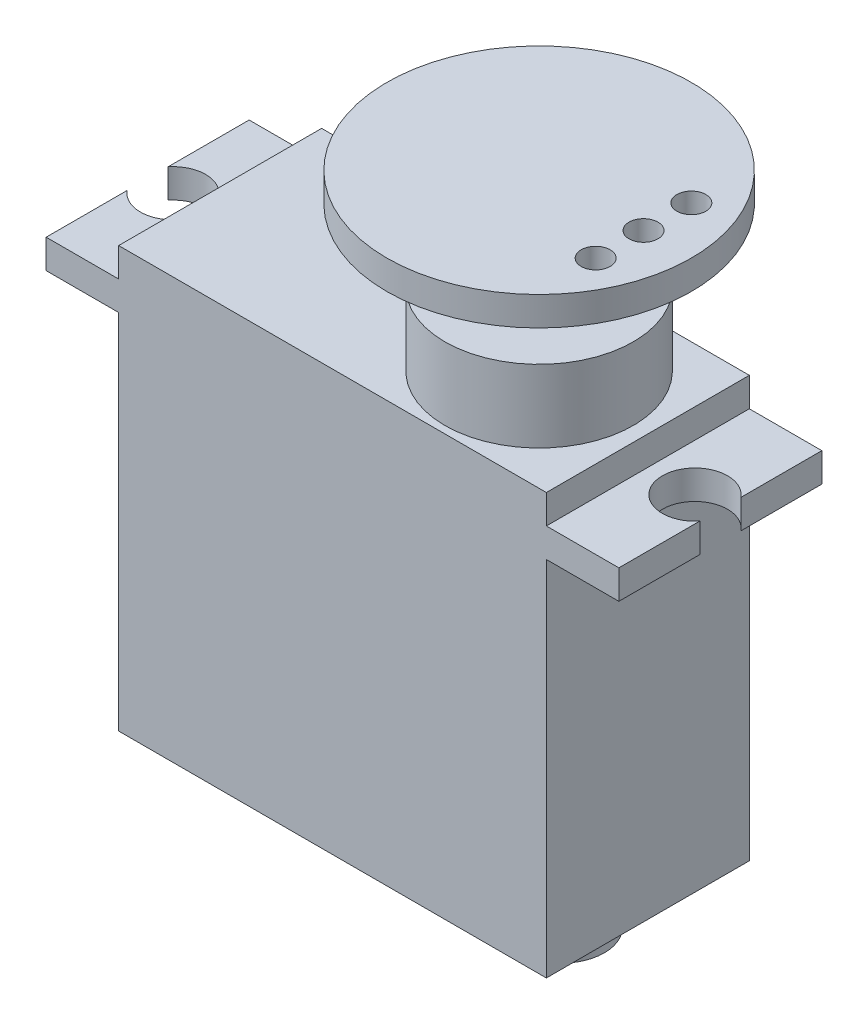
ISO-10303-21;
HEADER;
FILE_DESCRIPTION(('STEP AP214'),'2;1');
FILE_NAME('part.step','',(''),(''),'','','');
FILE_SCHEMA(('AUTOMOTIVE_DESIGN { 1 0 10303 214 1 1 1 1 }'));
ENDSEC;
DATA;
#1=APPLICATION_CONTEXT('core data for automotive mechanical design processes');
#2=APPLICATION_PROTOCOL_DEFINITION('international standard','automotive_design',2000,#1);
#3=PRODUCT_CONTEXT('',#1,'mechanical');
#4=PRODUCT('Part','Part','',(#3));
#5=PRODUCT_RELATED_PRODUCT_CATEGORY('part','',(#4));
#6=PRODUCT_DEFINITION_FORMATION('','',#4);
#7=PRODUCT_DEFINITION_CONTEXT('part definition',#1,'design');
#8=PRODUCT_DEFINITION('design','',#6,#7);
#9=PRODUCT_DEFINITION_SHAPE('','',#8);
#10=(LENGTH_UNIT() NAMED_UNIT(*) SI_UNIT(.MILLI.,.METRE.));
#11=(NAMED_UNIT(*) PLANE_ANGLE_UNIT() SI_UNIT($,.RADIAN.));
#12=(NAMED_UNIT(*) SI_UNIT($,.STERADIAN.) SOLID_ANGLE_UNIT());
#13=UNCERTAINTY_MEASURE_WITH_UNIT(LENGTH_MEASURE(1.E-05),#10,'distance_accuracy_value','');
#14=(GEOMETRIC_REPRESENTATION_CONTEXT(3) GLOBAL_UNCERTAINTY_ASSIGNED_CONTEXT((#13)) GLOBAL_UNIT_ASSIGNED_CONTEXT((#10,
#11,#12)) REPRESENTATION_CONTEXT('',''));
#15=CARTESIAN_POINT('',(0.,0.,0.));
#16=DIRECTION('',(0.,0.,1.));
#17=DIRECTION('',(1.,0.,0.));
#18=AXIS2_PLACEMENT_3D('',#15,#16,#17);
#19=CARTESIAN_POINT('',(7.25,12.,0.));
#20=DIRECTION('',(0.,1.,0.));
#21=DIRECTION('',(0.,0.,1.));
#22=AXIS2_PLACEMENT_3D('',#19,#20,#21);
#23=PLANE('',#22);
#24=CARTESIAN_POINT('',(14.45,12.,3.3));
#25=DIRECTION('',(0.,1.,0.));
#26=DIRECTION('',(0.,0.,1.));
#27=AXIS2_PLACEMENT_3D('',#24,#25,#26);
#28=CIRCLE('',#27,1.);
#29=CARTESIAN_POINT('',(14.45,12.,4.3));
#30=VERTEX_POINT('',#29);
#31=EDGE_CURVE('E616',#30,#30,#28,.F.);
#32=ORIENTED_EDGE('',*,*,#31,.T.);
#33=EDGE_LOOP('',(#32));
#34=FACE_BOUND('',#33,.T.);
#35=CARTESIAN_POINT('',(7.25,12.,0.));
#36=DIRECTION('',(0.,1.,0.));
#37=DIRECTION('',(0.,0.,1.));
#38=AXIS2_PLACEMENT_3D('',#35,#36,#37);
#39=CIRCLE('',#38,10.5);
#40=CARTESIAN_POINT('',(7.25,12.,10.5));
#41=VERTEX_POINT('',#40);
#42=EDGE_CURVE('E603',#41,#41,#39,.T.);
#43=ORIENTED_EDGE('',*,*,#42,.T.);
#44=EDGE_LOOP('',(#43));
#45=FACE_BOUND('',#44,.T.);
#46=CARTESIAN_POINT('',(14.45,12.,0.));
#47=DIRECTION('',(0.,1.,0.));
#48=DIRECTION('',(0.,0.,1.));
#49=AXIS2_PLACEMENT_3D('',#46,#47,#48);
#50=CIRCLE('',#49,1.);
#51=CARTESIAN_POINT('',(14.45,12.,1.));
#52=VERTEX_POINT('',#51);
#53=EDGE_CURVE('E608',#52,#52,#50,.T.);
#54=ORIENTED_EDGE('',*,*,#53,.F.);
#55=EDGE_LOOP('',(#54));
#56=FACE_BOUND('',#55,.T.);
#57=CARTESIAN_POINT('',(14.45,12.,-3.3));
#58=DIRECTION('',(0.,1.,0.));
#59=DIRECTION('',(0.,0.,1.));
#60=AXIS2_PLACEMENT_3D('',#57,#58,#59);
#61=CIRCLE('',#60,1.);
#62=CARTESIAN_POINT('',(14.45,12.,-2.3));
#63=VERTEX_POINT('',#62);
#64=EDGE_CURVE('E595',#63,#63,#61,.T.);
#65=ORIENTED_EDGE('',*,*,#64,.F.);
#66=EDGE_LOOP('',(#65));
#67=FACE_BOUND('',#66,.T.);
#68=ADVANCED_FACE('F34',(#34,#45,#56,#67),#23,.T.);
#69=CARTESIAN_POINT('',(7.25,10.,0.));
#70=DIRECTION('',(0.,1.,0.));
#71=DIRECTION('',(0.,0.,1.));
#72=AXIS2_PLACEMENT_3D('',#69,#70,#71);
#73=PLANE('',#72);
#74=CARTESIAN_POINT('',(14.45,10.,0.));
#75=DIRECTION('',(0.,1.,0.));
#76=DIRECTION('',(0.,0.,1.));
#77=AXIS2_PLACEMENT_3D('',#74,#75,#76);
#78=CIRCLE('',#77,1.);
#79=CARTESIAN_POINT('',(14.45,10.,1.));
#80=VERTEX_POINT('',#79);
#81=EDGE_CURVE('E605',#80,#80,#78,.F.);
#82=ORIENTED_EDGE('',*,*,#81,.F.);
#83=EDGE_LOOP('',(#82));
#84=FACE_BOUND('',#83,.T.);
#85=CARTESIAN_POINT('',(14.45,10.,3.3));
#86=DIRECTION('',(0.,1.,0.));
#87=DIRECTION('',(0.,0.,1.));
#88=AXIS2_PLACEMENT_3D('',#85,#86,#87);
#89=CIRCLE('',#88,1.);
#90=CARTESIAN_POINT('',(14.45,10.,4.3));
#91=VERTEX_POINT('',#90);
#92=EDGE_CURVE('E611',#91,#91,#89,.T.);
#93=ORIENTED_EDGE('',*,*,#92,.T.);
#94=EDGE_LOOP('',(#93));
#95=FACE_BOUND('',#94,.T.);
#96=CARTESIAN_POINT('',(7.25,10.,0.));
#97=DIRECTION('',(0.,1.,0.));
#98=DIRECTION('',(0.,0.,1.));
#99=AXIS2_PLACEMENT_3D('',#96,#97,#98);
#100=CIRCLE('',#99,2.5);
#101=CARTESIAN_POINT('',(7.25,10.,2.5));
#102=VERTEX_POINT('',#101);
#103=EDGE_CURVE('E619',#102,#102,#100,.T.);
#104=ORIENTED_EDGE('',*,*,#103,.T.);
#105=EDGE_LOOP('',(#104));
#106=FACE_BOUND('',#105,.T.);
#107=CARTESIAN_POINT('',(7.25,10.,0.));
#108=DIRECTION('',(0.,1.,0.));
#109=DIRECTION('',(0.,0.,1.));
#110=AXIS2_PLACEMENT_3D('',#107,#108,#109);
#111=CIRCLE('',#110,10.5);
#112=CARTESIAN_POINT('',(7.25,10.,10.5));
#113=VERTEX_POINT('',#112);
#114=EDGE_CURVE('E600',#113,#113,#111,.T.);
#115=ORIENTED_EDGE('',*,*,#114,.F.);
#116=EDGE_LOOP('',(#115));
#117=FACE_BOUND('',#116,.T.);
#118=CARTESIAN_POINT('',(14.45,10.,-3.3));
#119=DIRECTION('',(0.,1.,0.));
#120=DIRECTION('',(0.,0.,1.));
#121=AXIS2_PLACEMENT_3D('',#118,#119,#120);
#122=CIRCLE('',#121,1.);
#123=CARTESIAN_POINT('',(14.45,10.,-2.3));
#124=VERTEX_POINT('',#123);
#125=EDGE_CURVE('E598',#124,#124,#122,.F.);
#126=ORIENTED_EDGE('',*,*,#125,.F.);
#127=EDGE_LOOP('',(#126));
#128=FACE_BOUND('',#127,.T.);
#129=ADVANCED_FACE('F340',(#84,#95,#106,#117,#128),#73,.F.);
#130=CARTESIAN_POINT('',(-19.75,-4.,-7.));
#131=DIRECTION('',(1.,0.,0.));
#132=DIRECTION('',(0.,0.,-1.));
#133=AXIS2_PLACEMENT_3D('',#130,#131,#132);
#134=PLANE('',#133);
#135=DIRECTION('',(0.,1.,0.));
#136=VECTOR('',#135,1.);
#137=CARTESIAN_POINT('',(-19.75,-29.,-1.4142135623731));
#138=LINE('',#137,#136);
#139=CARTESIAN_POINT('',(-19.75,-2.,-1.4142135623731));
#140=VERTEX_POINT('',#139);
#141=CARTESIAN_POINT('',(-19.75,-4.,-1.4142135623731));
#142=VERTEX_POINT('',#141);
#143=EDGE_CURVE('E147',#140,#142,#138,.F.);
#144=ORIENTED_EDGE('',*,*,#143,.F.);
#145=DIRECTION('',(0.,0.,-1.));
#146=VECTOR('',#145,1.);
#147=CARTESIAN_POINT('',(-19.75,-2.,-7.));
#148=LINE('',#147,#146);
#149=CARTESIAN_POINT('',(-19.75,-2.,-7.));
#150=VERTEX_POINT('',#149);
#151=EDGE_CURVE('E158',#140,#150,#148,.T.);
#152=ORIENTED_EDGE('',*,*,#151,.T.);
#153=DIRECTION('',(0.,1.,0.));
#154=VECTOR('',#153,1.);
#155=CARTESIAN_POINT('',(-19.75,-4.,-7.));
#156=LINE('',#155,#154);
#157=CARTESIAN_POINT('',(-19.75,-4.,-7.));
#158=VERTEX_POINT('',#157);
#159=EDGE_CURVE('E178',#158,#150,#156,.T.);
#160=ORIENTED_EDGE('',*,*,#159,.F.);
#161=DIRECTION('',(0.,0.,-1.));
#162=VECTOR('',#161,1.);
#163=CARTESIAN_POINT('',(-19.75,-4.,-7.));
#164=LINE('',#163,#162);
#165=EDGE_CURVE('E160',#142,#158,#164,.T.);
#166=ORIENTED_EDGE('',*,*,#165,.F.);
#167=EDGE_LOOP('',(#144,#152,#160,#166));
#168=FACE_BOUND('',#167,.T.);
#169=ADVANCED_FACE('F156',(#168),#134,.F.);
#170=DIRECTION('',(0.,1.,0.));
#171=VECTOR('',#170,1.);
#172=CARTESIAN_POINT('',(-19.75,-29.,1.4142135623731));
#173=LINE('',#172,#171);
#174=CARTESIAN_POINT('',(-19.75,-4.,1.4142135623731));
#175=VERTEX_POINT('',#174);
#176=CARTESIAN_POINT('',(-19.75,-2.,1.4142135623731));
#177=VERTEX_POINT('',#176);
#178=EDGE_CURVE('E49',#175,#177,#173,.T.);
#179=ORIENTED_EDGE('',*,*,#178,.F.);
#180=CARTESIAN_POINT('',(-19.75,-4.,7.));
#181=VERTEX_POINT('',#180);
#182=EDGE_CURVE('E302',#181,#175,#164,.T.);
#183=ORIENTED_EDGE('',*,*,#182,.F.);
#184=DIRECTION('',(0.,1.,0.));
#185=VECTOR('',#184,1.);
#186=CARTESIAN_POINT('',(-19.75,-4.,7.));
#187=LINE('',#186,#185);
#188=CARTESIAN_POINT('',(-19.75,-2.,7.));
#189=VERTEX_POINT('',#188);
#190=EDGE_CURVE('E174',#181,#189,#187,.T.);
#191=ORIENTED_EDGE('',*,*,#190,.T.);
#192=EDGE_CURVE('E166',#189,#177,#148,.T.);
#193=ORIENTED_EDGE('',*,*,#192,.T.);
#194=EDGE_LOOP('',(#179,#183,#191,#193));
#195=FACE_BOUND('',#194,.T.);
#196=ADVANCED_FACE('F299',(#195),#134,.F.);
#197=CARTESIAN_POINT('',(-14.75,0.,7.));
#198=DIRECTION('',(1.,0.,0.));
#199=DIRECTION('',(0.,1.,0.));
#200=AXIS2_PLACEMENT_3D('',#197,#198,#199);
#201=PLANE('',#200);
#202=DIRECTION('',(0.,0.,1.));
#203=VECTOR('',#202,1.);
#204=CARTESIAN_POINT('',(-14.75,-4.,-7.));
#205=LINE('',#204,#203);
#206=CARTESIAN_POINT('',(-14.75,-4.,-7.));
#207=VERTEX_POINT('',#206);
#208=CARTESIAN_POINT('',(-14.75,-4.,7.));
#209=VERTEX_POINT('',#208);
#210=EDGE_CURVE('E173',#207,#209,#205,.T.);
#211=ORIENTED_EDGE('',*,*,#210,.F.);
#212=DIRECTION('',(0.,-1.,0.));
#213=VECTOR('',#212,1.);
#214=CARTESIAN_POINT('',(-14.75,0.,-7.));
#215=LINE('',#214,#213);
#216=CARTESIAN_POINT('',(-14.75,-29.,-7.));
#217=VERTEX_POINT('',#216);
#218=EDGE_CURVE('E225',#207,#217,#215,.T.);
#219=ORIENTED_EDGE('',*,*,#218,.T.);
#220=DIRECTION('',(0.,0.,-1.));
#221=VECTOR('',#220,1.);
#222=CARTESIAN_POINT('',(-14.75,-29.,7.));
#223=LINE('',#222,#221);
#224=CARTESIAN_POINT('',(-14.75,-29.,7.));
#225=VERTEX_POINT('',#224);
#226=EDGE_CURVE('E257',#225,#217,#223,.T.);
#227=ORIENTED_EDGE('',*,*,#226,.F.);
#228=DIRECTION('',(0.,-1.,0.));
#229=VECTOR('',#228,1.);
#230=CARTESIAN_POINT('',(-14.75,0.,7.));
#231=LINE('',#230,#229);
#232=EDGE_CURVE('E230',#209,#225,#231,.T.);
#233=ORIENTED_EDGE('',*,*,#232,.F.);
#234=EDGE_LOOP('',(#211,#219,#227,#233));
#235=FACE_BOUND('',#234,.T.);
#236=ADVANCED_FACE('F322',(#235),#201,.F.);
#237=CARTESIAN_POINT('',(19.75,-4.,-7.));
#238=DIRECTION('',(1.,0.,0.));
#239=DIRECTION('',(0.,0.,-1.));
#240=AXIS2_PLACEMENT_3D('',#237,#238,#239);
#241=PLANE('',#240);
#242=DIRECTION('',(0.,1.,0.));
#243=VECTOR('',#242,1.);
#244=CARTESIAN_POINT('',(19.75,-29.,-1.4142135623731));
#245=LINE('',#244,#243);
#246=CARTESIAN_POINT('',(19.75,-4.,-1.4142135623731));
#247=VERTEX_POINT('',#246);
#248=CARTESIAN_POINT('',(19.75,-2.,-1.4142135623731));
#249=VERTEX_POINT('',#248);
#250=EDGE_CURVE('E194',#247,#249,#245,.T.);
#251=ORIENTED_EDGE('',*,*,#250,.F.);
#252=DIRECTION('',(0.,0.,-1.));
#253=VECTOR('',#252,1.);
#254=CARTESIAN_POINT('',(19.75,-4.,-7.));
#255=LINE('',#254,#253);
#256=CARTESIAN_POINT('',(19.75,-4.,-7.));
#257=VERTEX_POINT('',#256);
#258=EDGE_CURVE('E204',#247,#257,#255,.T.);
#259=ORIENTED_EDGE('',*,*,#258,.T.);
#260=DIRECTION('',(0.,1.,0.));
#261=VECTOR('',#260,1.);
#262=CARTESIAN_POINT('',(19.75,-4.,-7.));
#263=LINE('',#262,#261);
#264=CARTESIAN_POINT('',(19.75,-2.,-7.));
#265=VERTEX_POINT('',#264);
#266=EDGE_CURVE('E222',#257,#265,#263,.T.);
#267=ORIENTED_EDGE('',*,*,#266,.T.);
#268=DIRECTION('',(0.,0.,-1.));
#269=VECTOR('',#268,1.);
#270=CARTESIAN_POINT('',(19.75,-2.,-7.));
#271=LINE('',#270,#269);
#272=EDGE_CURVE('E217',#249,#265,#271,.T.);
#273=ORIENTED_EDGE('',*,*,#272,.F.);
#274=EDGE_LOOP('',(#251,#259,#267,#273));
#275=FACE_BOUND('',#274,.T.);
#276=ADVANCED_FACE('F282',(#275),#241,.T.);
#277=CARTESIAN_POINT('',(14.75,0.,7.));
#278=DIRECTION('',(-1.,0.,0.));
#279=DIRECTION('',(0.,-1.,0.));
#280=AXIS2_PLACEMENT_3D('',#277,#278,#279);
#281=PLANE('',#280);
#282=DIRECTION('',(0.,0.,1.));
#283=VECTOR('',#282,1.);
#284=CARTESIAN_POINT('',(14.75,-2.,-7.));
#285=LINE('',#284,#283);
#286=CARTESIAN_POINT('',(14.75,-2.,-7.));
#287=VERTEX_POINT('',#286);
#288=CARTESIAN_POINT('',(14.75,-2.,7.));
#289=VERTEX_POINT('',#288);
#290=EDGE_CURVE('E196',#287,#289,#285,.T.);
#291=ORIENTED_EDGE('',*,*,#290,.F.);
#292=DIRECTION('',(0.,1.,0.));
#293=VECTOR('',#292,1.);
#294=CARTESIAN_POINT('',(14.75,0.,-7.));
#295=LINE('',#294,#293);
#296=CARTESIAN_POINT('',(14.75,0.,-7.));
#297=VERTEX_POINT('',#296);
#298=EDGE_CURVE('E243',#287,#297,#295,.T.);
#299=ORIENTED_EDGE('',*,*,#298,.T.);
#300=DIRECTION('',(0.,0.,-1.));
#301=VECTOR('',#300,1.);
#302=CARTESIAN_POINT('',(14.75,0.,7.));
#303=LINE('',#302,#301);
#304=CARTESIAN_POINT('',(14.75,0.,7.));
#305=VERTEX_POINT('',#304);
#306=EDGE_CURVE('E251',#305,#297,#303,.T.);
#307=ORIENTED_EDGE('',*,*,#306,.F.);
#308=DIRECTION('',(0.,1.,0.));
#309=VECTOR('',#308,1.);
#310=CARTESIAN_POINT('',(14.75,0.,7.));
#311=LINE('',#310,#309);
#312=EDGE_CURVE('E232',#289,#305,#311,.T.);
#313=ORIENTED_EDGE('',*,*,#312,.F.);
#314=EDGE_LOOP('',(#291,#299,#307,#313));
#315=FACE_BOUND('',#314,.T.);
#316=ADVANCED_FACE('F288',(#315),#281,.F.);
#317=CARTESIAN_POINT('',(-14.75,0.,-7.));
#318=VERTEX_POINT('',#317);
#319=CARTESIAN_POINT('',(-14.75,-2.,-7.));
#320=VERTEX_POINT('',#319);
#321=EDGE_CURVE('E239',#318,#320,#215,.T.);
#322=ORIENTED_EDGE('',*,*,#321,.T.);
#323=DIRECTION('',(0.,0.,1.));
#324=VECTOR('',#323,1.);
#325=CARTESIAN_POINT('',(-14.75,-2.,-7.));
#326=LINE('',#325,#324);
#327=CARTESIAN_POINT('',(-14.75,-2.,7.));
#328=VERTEX_POINT('',#327);
#329=EDGE_CURVE('E57',#320,#328,#326,.T.);
#330=ORIENTED_EDGE('',*,*,#329,.T.);
#331=CARTESIAN_POINT('',(-14.75,0.,7.));
#332=VERTEX_POINT('',#331);
#333=EDGE_CURVE('E227',#332,#328,#231,.T.);
#334=ORIENTED_EDGE('',*,*,#333,.F.);
#335=DIRECTION('',(0.,0.,-1.));
#336=VECTOR('',#335,1.);
#337=CARTESIAN_POINT('',(-14.75,0.,7.));
#338=LINE('',#337,#336);
#339=EDGE_CURVE('E238',#332,#318,#338,.T.);
#340=ORIENTED_EDGE('',*,*,#339,.T.);
#341=EDGE_LOOP('',(#322,#330,#334,#340));
#342=FACE_BOUND('',#341,.T.);
#343=ADVANCED_FACE('F36',(#342),#201,.F.);
#344=CARTESIAN_POINT('',(-14.75,-29.,7.));
#345=DIRECTION('',(0.,1.,0.));
#346=DIRECTION('',(-1.,0.,0.));
#347=AXIS2_PLACEMENT_3D('',#344,#345,#346);
#348=PLANE('',#347);
#349=CARTESIAN_POINT('',(8.75,-29.,0.));
#350=DIRECTION('',(0.,1.,0.));
#351=DIRECTION('',(-1.,0.,0.));
#352=AXIS2_PLACEMENT_3D('',#349,#350,#351);
#353=CIRCLE('',#352,3.);
#354=CARTESIAN_POINT('',(5.75,-29.,0.));
#355=VERTEX_POINT('',#354);
#356=EDGE_CURVE('E11',#355,#355,#353,.F.);
#357=ORIENTED_EDGE('',*,*,#356,.F.);
#358=EDGE_LOOP('',(#357));
#359=FACE_BOUND('',#358,.T.);
#360=DIRECTION('',(1.,0.,0.));
#361=VECTOR('',#360,1.);
#362=CARTESIAN_POINT('',(-14.75,-29.,-7.));
#363=LINE('',#362,#361);
#364=CARTESIAN_POINT('',(14.75,-29.,-7.));
#365=VERTEX_POINT('',#364);
#366=EDGE_CURVE('E241',#217,#365,#363,.T.);
#367=ORIENTED_EDGE('',*,*,#366,.T.);
#368=DIRECTION('',(0.,0.,-1.));
#369=VECTOR('',#368,1.);
#370=CARTESIAN_POINT('',(14.75,-29.,7.));
#371=LINE('',#370,#369);
#372=CARTESIAN_POINT('',(14.75,-29.,7.));
#373=VERTEX_POINT('',#372);
#374=EDGE_CURVE('E254',#373,#365,#371,.T.);
#375=ORIENTED_EDGE('',*,*,#374,.F.);
#376=DIRECTION('',(1.,0.,0.));
#377=VECTOR('',#376,1.);
#378=CARTESIAN_POINT('',(-14.75,-29.,7.));
#379=LINE('',#378,#377);
#380=EDGE_CURVE('E229',#225,#373,#379,.T.);
#381=ORIENTED_EDGE('',*,*,#380,.F.);
#382=ORIENTED_EDGE('',*,*,#226,.T.);
#383=EDGE_LOOP('',(#367,#375,#381,#382));
#384=FACE_BOUND('',#383,.T.);
#385=ADVANCED_FACE('F324',(#359,#384),#348,.F.);
#386=CARTESIAN_POINT('',(14.75,-4.,-7.));
#387=VERTEX_POINT('',#386);
#388=EDGE_CURVE('E244',#365,#387,#295,.T.);
#389=ORIENTED_EDGE('',*,*,#388,.T.);
#390=DIRECTION('',(0.,0.,1.));
#391=VECTOR('',#390,1.);
#392=CARTESIAN_POINT('',(14.75,-4.,-7.));
#393=LINE('',#392,#391);
#394=CARTESIAN_POINT('',(14.75,-4.,7.));
#395=VERTEX_POINT('',#394);
#396=EDGE_CURVE('E197',#387,#395,#393,.T.);
#397=ORIENTED_EDGE('',*,*,#396,.T.);
#398=EDGE_CURVE('E233',#373,#395,#311,.T.);
#399=ORIENTED_EDGE('',*,*,#398,.F.);
#400=ORIENTED_EDGE('',*,*,#374,.T.);
#401=EDGE_LOOP('',(#389,#397,#399,#400));
#402=FACE_BOUND('',#401,.T.);
#403=ADVANCED_FACE('F328',(#402),#281,.F.);
#404=CARTESIAN_POINT('',(-14.75,0.,7.));
#405=DIRECTION('',(0.,-1.,0.));
#406=DIRECTION('',(0.,0.,-1.));
#407=AXIS2_PLACEMENT_3D('',#404,#405,#406);
#408=PLANE('',#407);
#409=CARTESIAN_POINT('',(7.25,0.,0.));
#410=DIRECTION('',(0.,1.,0.));
#411=DIRECTION('',(0.,0.,1.));
#412=AXIS2_PLACEMENT_3D('',#409,#410,#411);
#413=CIRCLE('',#412,6.5);
#414=CARTESIAN_POINT('',(7.25,0.,6.5));
#415=VERTEX_POINT('',#414);
#416=EDGE_CURVE('E153',#415,#415,#413,.T.);
#417=ORIENTED_EDGE('',*,*,#416,.F.);
#418=EDGE_LOOP('',(#417));
#419=FACE_BOUND('',#418,.T.);
#420=DIRECTION('',(-1.,0.,0.));
#421=VECTOR('',#420,1.);
#422=CARTESIAN_POINT('',(-14.75,0.,-7.));
#423=LINE('',#422,#421);
#424=EDGE_CURVE('E247',#297,#318,#423,.T.);
#425=ORIENTED_EDGE('',*,*,#424,.T.);
#426=ORIENTED_EDGE('',*,*,#339,.F.);
#427=DIRECTION('',(-1.,0.,0.));
#428=VECTOR('',#427,1.);
#429=CARTESIAN_POINT('',(-14.75,0.,7.));
#430=LINE('',#429,#428);
#431=EDGE_CURVE('E236',#305,#332,#430,.T.);
#432=ORIENTED_EDGE('',*,*,#431,.F.);
#433=ORIENTED_EDGE('',*,*,#306,.T.);
#434=EDGE_LOOP('',(#425,#426,#432,#433));
#435=FACE_BOUND('',#434,.T.);
#436=ADVANCED_FACE('F294',(#419,#435),#408,.F.);
#437=CARTESIAN_POINT('',(0.,0.,7.));
#438=DIRECTION('',(0.,0.,1.));
#439=DIRECTION('',(1.,0.,0.));
#440=AXIS2_PLACEMENT_3D('',#437,#438,#439);
#441=PLANE('',#440);
#442=ORIENTED_EDGE('',*,*,#333,.T.);
#443=DIRECTION('',(-1.,0.,0.));
#444=VECTOR('',#443,1.);
#445=CARTESIAN_POINT('',(-14.75,-2.,7.));
#446=LINE('',#445,#444);
#447=EDGE_CURVE('E168',#328,#189,#446,.T.);
#448=ORIENTED_EDGE('',*,*,#447,.T.);
#449=ORIENTED_EDGE('',*,*,#190,.F.);
#450=DIRECTION('',(-1.,0.,0.));
#451=VECTOR('',#450,1.);
#452=CARTESIAN_POINT('',(-14.75,-4.,7.));
#453=LINE('',#452,#451);
#454=EDGE_CURVE('E180',#209,#181,#453,.T.);
#455=ORIENTED_EDGE('',*,*,#454,.F.);
#456=ORIENTED_EDGE('',*,*,#232,.T.);
#457=ORIENTED_EDGE('',*,*,#380,.T.);
#458=ORIENTED_EDGE('',*,*,#398,.T.);
#459=DIRECTION('',(1.,0.,0.));
#460=VECTOR('',#459,1.);
#461=CARTESIAN_POINT('',(14.75,-4.,7.));
#462=LINE('',#461,#460);
#463=CARTESIAN_POINT('',(19.75,-4.,7.));
#464=VERTEX_POINT('',#463);
#465=EDGE_CURVE('E200',#395,#464,#462,.T.);
#466=ORIENTED_EDGE('',*,*,#465,.T.);
#467=DIRECTION('',(0.,1.,0.));
#468=VECTOR('',#467,1.);
#469=CARTESIAN_POINT('',(19.75,-4.,7.));
#470=LINE('',#469,#468);
#471=CARTESIAN_POINT('',(19.75,-2.,7.));
#472=VERTEX_POINT('',#471);
#473=EDGE_CURVE('E211',#464,#472,#470,.T.);
#474=ORIENTED_EDGE('',*,*,#473,.T.);
#475=DIRECTION('',(1.,0.,0.));
#476=VECTOR('',#475,1.);
#477=CARTESIAN_POINT('',(14.75,-2.,7.));
#478=LINE('',#477,#476);
#479=EDGE_CURVE('E214',#289,#472,#478,.T.);
#480=ORIENTED_EDGE('',*,*,#479,.F.);
#481=ORIENTED_EDGE('',*,*,#312,.T.);
#482=ORIENTED_EDGE('',*,*,#431,.T.);
#483=EDGE_LOOP('',(#442,#448,#449,#455,#456,#457,#458,#466,#474,#480,#481,#482));
#484=FACE_BOUND('',#483,.T.);
#485=ADVANCED_FACE('F275',(#484),#441,.T.);
#486=CARTESIAN_POINT('',(0.,0.,-7.));
#487=DIRECTION('',(0.,0.,1.));
#488=DIRECTION('',(1.,0.,0.));
#489=AXIS2_PLACEMENT_3D('',#486,#487,#488);
#490=PLANE('',#489);
#491=ORIENTED_EDGE('',*,*,#321,.F.);
#492=ORIENTED_EDGE('',*,*,#424,.F.);
#493=ORIENTED_EDGE('',*,*,#298,.F.);
#494=DIRECTION('',(-1.,0.,0.));
#495=VECTOR('',#494,1.);
#496=CARTESIAN_POINT('',(14.75,-2.,-7.));
#497=LINE('',#496,#495);
#498=EDGE_CURVE('E201',#265,#287,#497,.T.);
#499=ORIENTED_EDGE('',*,*,#498,.F.);
#500=ORIENTED_EDGE('',*,*,#266,.F.);
#501=DIRECTION('',(-1.,0.,0.));
#502=VECTOR('',#501,1.);
#503=CARTESIAN_POINT('',(14.75,-4.,-7.));
#504=LINE('',#503,#502);
#505=EDGE_CURVE('E208',#257,#387,#504,.T.);
#506=ORIENTED_EDGE('',*,*,#505,.T.);
#507=ORIENTED_EDGE('',*,*,#388,.F.);
#508=ORIENTED_EDGE('',*,*,#366,.F.);
#509=ORIENTED_EDGE('',*,*,#218,.F.);
#510=DIRECTION('',(1.,0.,0.));
#511=VECTOR('',#510,1.);
#512=CARTESIAN_POINT('',(-14.75,-4.,-7.));
#513=LINE('',#512,#511);
#514=EDGE_CURVE('E311',#158,#207,#513,.T.);
#515=ORIENTED_EDGE('',*,*,#514,.F.);
#516=ORIENTED_EDGE('',*,*,#159,.T.);
#517=DIRECTION('',(1.,0.,0.));
#518=VECTOR('',#517,1.);
#519=CARTESIAN_POINT('',(-14.75,-2.,-7.));
#520=LINE('',#519,#518);
#521=EDGE_CURVE('E165',#150,#320,#520,.T.);
#522=ORIENTED_EDGE('',*,*,#521,.T.);
#523=EDGE_LOOP('',(#491,#492,#493,#499,#500,#506,#507,#508,#509,#515,#516,#522));
#524=FACE_BOUND('',#523,.T.);
#525=ADVANCED_FACE('F291',(#524),#490,.F.);
#526=DIRECTION('',(0.,1.,0.));
#527=VECTOR('',#526,1.);
#528=CARTESIAN_POINT('',(19.75,-29.,1.4142135623731));
#529=LINE('',#528,#527);
#530=CARTESIAN_POINT('',(19.75,-2.,1.4142135623731));
#531=VERTEX_POINT('',#530);
#532=CARTESIAN_POINT('',(19.75,-4.,1.4142135623731));
#533=VERTEX_POINT('',#532);
#534=EDGE_CURVE('E192',#531,#533,#529,.F.);
#535=ORIENTED_EDGE('',*,*,#534,.F.);
#536=EDGE_CURVE('E218',#472,#531,#271,.T.);
#537=ORIENTED_EDGE('',*,*,#536,.F.);
#538=ORIENTED_EDGE('',*,*,#473,.F.);
#539=EDGE_CURVE('E205',#464,#533,#255,.T.);
#540=ORIENTED_EDGE('',*,*,#539,.T.);
#541=EDGE_LOOP('',(#535,#537,#538,#540));
#542=FACE_BOUND('',#541,.T.);
#543=ADVANCED_FACE('F269',(#542),#241,.T.);
#544=CARTESIAN_POINT('',(0.,-4.,0.));
#545=DIRECTION('',(0.,1.,0.));
#546=DIRECTION('',(0.,0.,1.));
#547=AXIS2_PLACEMENT_3D('',#544,#545,#546);
#548=PLANE('',#547);
#549=ORIENTED_EDGE('',*,*,#258,.F.);
#550=CARTESIAN_POINT('',(18.,-4.,0.));
#551=DIRECTION('',(0.,1.,0.));
#552=DIRECTION('',(0.,0.,1.));
#553=AXIS2_PLACEMENT_3D('',#550,#551,#552);
#554=CIRCLE('',#553,2.25);
#555=EDGE_CURVE('E186',#247,#533,#554,.T.);
#556=ORIENTED_EDGE('',*,*,#555,.T.);
#557=ORIENTED_EDGE('',*,*,#539,.F.);
#558=ORIENTED_EDGE('',*,*,#465,.F.);
#559=ORIENTED_EDGE('',*,*,#396,.F.);
#560=ORIENTED_EDGE('',*,*,#505,.F.);
#561=EDGE_LOOP('',(#549,#556,#557,#558,#559,#560));
#562=FACE_BOUND('',#561,.T.);
#563=ADVANCED_FACE('F279',(#562),#548,.F.);
#564=CARTESIAN_POINT('',(0.,-2.,0.));
#565=DIRECTION('',(0.,1.,0.));
#566=DIRECTION('',(0.,0.,1.));
#567=AXIS2_PLACEMENT_3D('',#564,#565,#566);
#568=PLANE('',#567);
#569=CARTESIAN_POINT('',(18.,-2.,0.));
#570=DIRECTION('',(0.,1.,0.));
#571=DIRECTION('',(0.,0.,1.));
#572=AXIS2_PLACEMENT_3D('',#569,#570,#571);
#573=CIRCLE('',#572,2.25);
#574=EDGE_CURVE('E189',#249,#531,#573,.T.);
#575=ORIENTED_EDGE('',*,*,#574,.F.);
#576=ORIENTED_EDGE('',*,*,#272,.T.);
#577=ORIENTED_EDGE('',*,*,#498,.T.);
#578=ORIENTED_EDGE('',*,*,#290,.T.);
#579=ORIENTED_EDGE('',*,*,#479,.T.);
#580=ORIENTED_EDGE('',*,*,#536,.T.);
#581=EDGE_LOOP('',(#575,#576,#577,#578,#579,#580));
#582=FACE_BOUND('',#581,.T.);
#583=ADVANCED_FACE('F271',(#582),#568,.T.);
#584=CARTESIAN_POINT('',(18.,-29.,0.));
#585=DIRECTION('',(0.,1.,0.));
#586=DIRECTION('',(0.,0.,1.));
#587=AXIS2_PLACEMENT_3D('',#584,#585,#586);
#588=CYLINDRICAL_SURFACE('',#587,2.25);
#589=ORIENTED_EDGE('',*,*,#250,.T.);
#590=ORIENTED_EDGE('',*,*,#574,.T.);
#591=ORIENTED_EDGE('',*,*,#534,.T.);
#592=ORIENTED_EDGE('',*,*,#555,.F.);
#593=EDGE_LOOP('',(#589,#590,#591,#592));
#594=FACE_BOUND('',#593,.T.);
#595=ADVANCED_FACE('F263',(#594),#588,.F.);
#596=CARTESIAN_POINT('',(7.25,5.,0.));
#597=DIRECTION('',(0.,-1.,0.));
#598=DIRECTION('',(0.,0.,-1.));
#599=AXIS2_PLACEMENT_3D('',#596,#597,#598);
#600=CYLINDRICAL_SURFACE('',#599,6.5);
#601=CARTESIAN_POINT('',(7.25,5.,0.));
#602=DIRECTION('',(0.,1.,0.));
#603=DIRECTION('',(0.,0.,1.));
#604=AXIS2_PLACEMENT_3D('',#601,#602,#603);
#605=CIRCLE('',#604,6.5);
#606=CARTESIAN_POINT('',(7.25,5.,6.5));
#607=VERTEX_POINT('',#606);
#608=EDGE_CURVE('E183',#607,#607,#605,.T.);
#609=ORIENTED_EDGE('',*,*,#608,.F.);
#610=EDGE_LOOP('',(#609));
#611=FACE_BOUND('',#610,.T.);
#612=ORIENTED_EDGE('',*,*,#416,.T.);
#613=EDGE_LOOP('',(#612));
#614=FACE_BOUND('',#613,.T.);
#615=ADVANCED_FACE('F381',(#611,#614),#600,.T.);
#616=CARTESIAN_POINT('',(0.,5.,0.));
#617=DIRECTION('',(0.,1.,0.));
#618=DIRECTION('',(0.,0.,1.));
#619=AXIS2_PLACEMENT_3D('',#616,#617,#618);
#620=PLANE('',#619);
#621=CARTESIAN_POINT('',(7.25,5.,0.));
#622=DIRECTION('',(0.,1.,0.));
#623=DIRECTION('',(0.,0.,1.));
#624=AXIS2_PLACEMENT_3D('',#621,#622,#623);
#625=CIRCLE('',#624,2.5);
#626=CARTESIAN_POINT('',(7.25,5.,2.5));
#627=VERTEX_POINT('',#626);
#628=EDGE_CURVE('E177',#627,#627,#625,.T.);
#629=ORIENTED_EDGE('',*,*,#628,.F.);
#630=EDGE_LOOP('',(#629));
#631=FACE_BOUND('',#630,.T.);
#632=ORIENTED_EDGE('',*,*,#608,.T.);
#633=EDGE_LOOP('',(#632));
#634=FACE_BOUND('',#633,.T.);
#635=ADVANCED_FACE('F374',(#631,#634),#620,.T.);
#636=CARTESIAN_POINT('',(0.,-4.,0.));
#637=DIRECTION('',(0.,1.,0.));
#638=DIRECTION('',(0.,0.,1.));
#639=AXIS2_PLACEMENT_3D('',#636,#637,#638);
#640=PLANE('',#639);
#641=CARTESIAN_POINT('',(-18.,-4.,0.));
#642=DIRECTION('',(0.,1.,0.));
#643=DIRECTION('',(0.,0.,1.));
#644=AXIS2_PLACEMENT_3D('',#641,#642,#643);
#645=CIRCLE('',#644,2.25);
#646=EDGE_CURVE('E318',#142,#175,#645,.F.);
#647=ORIENTED_EDGE('',*,*,#646,.F.);
#648=ORIENTED_EDGE('',*,*,#165,.T.);
#649=ORIENTED_EDGE('',*,*,#514,.T.);
#650=ORIENTED_EDGE('',*,*,#210,.T.);
#651=ORIENTED_EDGE('',*,*,#454,.T.);
#652=ORIENTED_EDGE('',*,*,#182,.T.);
#653=EDGE_LOOP('',(#647,#648,#649,#650,#651,#652));
#654=FACE_BOUND('',#653,.T.);
#655=ADVANCED_FACE('F309',(#654),#640,.F.);
#656=CARTESIAN_POINT('',(0.,-2.,0.));
#657=DIRECTION('',(0.,1.,0.));
#658=DIRECTION('',(0.,0.,1.));
#659=AXIS2_PLACEMENT_3D('',#656,#657,#658);
#660=PLANE('',#659);
#661=ORIENTED_EDGE('',*,*,#151,.F.);
#662=CARTESIAN_POINT('',(-18.,-2.,0.));
#663=DIRECTION('',(0.,1.,0.));
#664=DIRECTION('',(0.,0.,1.));
#665=AXIS2_PLACEMENT_3D('',#662,#663,#664);
#666=CIRCLE('',#665,2.25);
#667=EDGE_CURVE('E42',#140,#177,#666,.F.);
#668=ORIENTED_EDGE('',*,*,#667,.T.);
#669=ORIENTED_EDGE('',*,*,#192,.F.);
#670=ORIENTED_EDGE('',*,*,#447,.F.);
#671=ORIENTED_EDGE('',*,*,#329,.F.);
#672=ORIENTED_EDGE('',*,*,#521,.F.);
#673=EDGE_LOOP('',(#661,#668,#669,#670,#671,#672));
#674=FACE_BOUND('',#673,.T.);
#675=ADVANCED_FACE('F163',(#674),#660,.T.);
#676=CARTESIAN_POINT('',(-18.,-29.,0.));
#677=DIRECTION('',(0.,1.,0.));
#678=DIRECTION('',(0.,0.,1.));
#679=AXIS2_PLACEMENT_3D('',#676,#677,#678);
#680=CYLINDRICAL_SURFACE('',#679,2.25);
#681=ORIENTED_EDGE('',*,*,#143,.T.);
#682=ORIENTED_EDGE('',*,*,#646,.T.);
#683=ORIENTED_EDGE('',*,*,#178,.T.);
#684=ORIENTED_EDGE('',*,*,#667,.F.);
#685=EDGE_LOOP('',(#681,#682,#683,#684));
#686=FACE_BOUND('',#685,.T.);
#687=ADVANCED_FACE('F146',(#686),#680,.F.);
#688=CARTESIAN_POINT('',(8.75,-32.5,0.));
#689=DIRECTION('',(0.,1.,0.));
#690=DIRECTION('',(-1.,0.,0.));
#691=AXIS2_PLACEMENT_3D('',#688,#689,#690);
#692=CYLINDRICAL_SURFACE('',#691,3.);
#693=CARTESIAN_POINT('',(8.75,-32.5,0.));
#694=DIRECTION('',(0.,-1.,0.));
#695=DIRECTION('',(1.,0.,0.));
#696=AXIS2_PLACEMENT_3D('',#693,#694,#695);
#697=CIRCLE('',#696,3.);
#698=CARTESIAN_POINT('',(11.75,-32.5,0.));
#699=VERTEX_POINT('',#698);
#700=EDGE_CURVE('E623',#699,#699,#697,.T.);
#701=ORIENTED_EDGE('',*,*,#700,.F.);
#702=EDGE_LOOP('',(#701));
#703=FACE_BOUND('',#702,.T.);
#704=ORIENTED_EDGE('',*,*,#356,.T.);
#705=EDGE_LOOP('',(#704));
#706=FACE_BOUND('',#705,.T.);
#707=ADVANCED_FACE('F365',(#703,#706),#692,.T.);
#708=CARTESIAN_POINT('',(8.75,-32.5,0.));
#709=DIRECTION('',(0.,-1.,0.));
#710=DIRECTION('',(1.,0.,0.));
#711=AXIS2_PLACEMENT_3D('',#708,#709,#710);
#712=PLANE('',#711);
#713=ORIENTED_EDGE('',*,*,#700,.T.);
#714=EDGE_LOOP('',(#713));
#715=FACE_BOUND('',#714,.T.);
#716=ADVANCED_FACE('F361',(#715),#712,.T.);
#717=CARTESIAN_POINT('',(7.25,17.0710678118655,0.));
#718=DIRECTION('',(0.,-1.,0.));
#719=DIRECTION('',(0.,0.,-1.));
#720=AXIS2_PLACEMENT_3D('',#717,#718,#719);
#721=CYLINDRICAL_SURFACE('',#720,2.5);
#722=ORIENTED_EDGE('',*,*,#628,.T.);
#723=EDGE_LOOP('',(#722));
#724=FACE_BOUND('',#723,.T.);
#725=ORIENTED_EDGE('',*,*,#103,.F.);
#726=EDGE_LOOP('',(#725));
#727=FACE_BOUND('',#726,.T.);
#728=ADVANCED_FACE('F357',(#724,#727),#721,.T.);
#729=CARTESIAN_POINT('',(7.25,12.,0.));
#730=DIRECTION('',(0.,-1.,0.));
#731=DIRECTION('',(0.,0.,-1.));
#732=AXIS2_PLACEMENT_3D('',#729,#730,#731);
#733=CYLINDRICAL_SURFACE('',#732,10.5);
#734=ORIENTED_EDGE('',*,*,#42,.F.);
#735=EDGE_LOOP('',(#734));
#736=FACE_BOUND('',#735,.T.);
#737=ORIENTED_EDGE('',*,*,#114,.T.);
#738=EDGE_LOOP('',(#737));
#739=FACE_BOUND('',#738,.T.);
#740=ADVANCED_FACE('F354',(#736,#739),#733,.T.);
#741=CARTESIAN_POINT('',(14.45,-32.501,3.3));
#742=DIRECTION('',(0.,1.,0.));
#743=DIRECTION('',(0.,0.,1.));
#744=AXIS2_PLACEMENT_3D('',#741,#742,#743);
#745=CYLINDRICAL_SURFACE('',#744,1.);
#746=ORIENTED_EDGE('',*,*,#31,.F.);
#747=EDGE_LOOP('',(#746));
#748=FACE_BOUND('',#747,.T.);
#749=ORIENTED_EDGE('',*,*,#92,.F.);
#750=EDGE_LOOP('',(#749));
#751=FACE_BOUND('',#750,.T.);
#752=ADVANCED_FACE('F351',(#748,#751),#745,.F.);
#753=CARTESIAN_POINT('',(14.45,-32.501,0.));
#754=DIRECTION('',(0.,1.,0.));
#755=DIRECTION('',(0.,0.,1.));
#756=AXIS2_PLACEMENT_3D('',#753,#754,#755);
#757=CYLINDRICAL_SURFACE('',#756,1.);
#758=ORIENTED_EDGE('',*,*,#53,.T.);
#759=EDGE_LOOP('',(#758));
#760=FACE_BOUND('',#759,.T.);
#761=ORIENTED_EDGE('',*,*,#81,.T.);
#762=EDGE_LOOP('',(#761));
#763=FACE_BOUND('',#762,.T.);
#764=ADVANCED_FACE('F463',(#760,#763),#757,.F.);
#765=CARTESIAN_POINT('',(14.45,-32.501,-3.3));
#766=DIRECTION('',(0.,1.,0.));
#767=DIRECTION('',(0.,0.,1.));
#768=AXIS2_PLACEMENT_3D('',#765,#766,#767);
#769=CYLINDRICAL_SURFACE('',#768,1.);
#770=ORIENTED_EDGE('',*,*,#64,.T.);
#771=EDGE_LOOP('',(#770));
#772=FACE_BOUND('',#771,.T.);
#773=ORIENTED_EDGE('',*,*,#125,.T.);
#774=EDGE_LOOP('',(#773));
#775=FACE_BOUND('',#774,.T.);
#776=ADVANCED_FACE('F471',(#772,#775),#769,.F.);
#777=CLOSED_SHELL('',(#68,#129,#169,#196,#236,#276,#316,#343,#385,#403,#436,#485,#525,#543,#563,
#583,#595,#615,#635,#655,#675,#687,#707,#716,#728,#740,#752,#764,#776));
#778=MANIFOLD_SOLID_BREP('B2',#777);
#779=ADVANCED_BREP_SHAPE_REPRESENTATION('',(#18,#778),#14);
#780=SHAPE_DEFINITION_REPRESENTATION(#9,#779);
ENDSEC;
END-ISO-10303-21;
